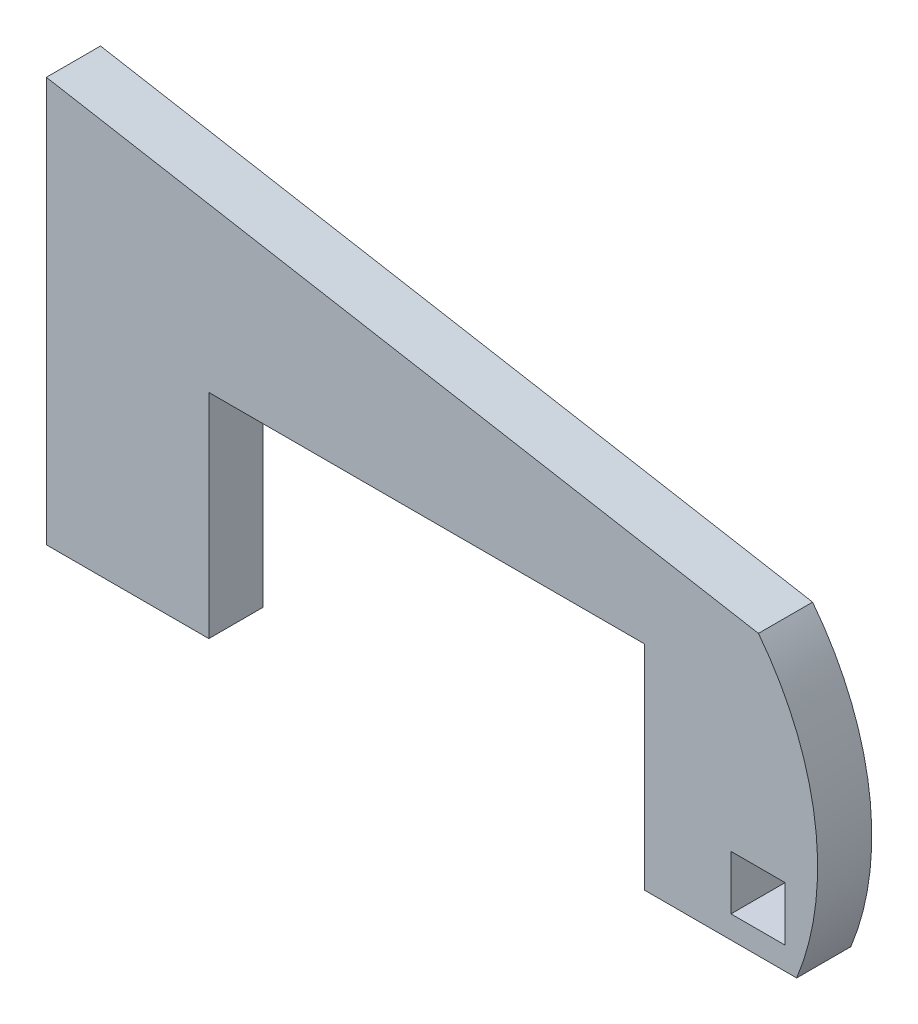
ISO-10303-21;
HEADER;
FILE_DESCRIPTION(('STEP AP214'),'2;1');
FILE_NAME('part.step','',(''),(''),'','','');
FILE_SCHEMA(('AUTOMOTIVE_DESIGN { 1 0 10303 214 1 1 1 1 }'));
ENDSEC;
DATA;
#1=APPLICATION_CONTEXT('core data for automotive mechanical design processes');
#2=APPLICATION_PROTOCOL_DEFINITION('international standard','automotive_design',2000,#1);
#3=PRODUCT_CONTEXT('',#1,'mechanical');
#4=PRODUCT('Part','Part','',(#3));
#5=PRODUCT_RELATED_PRODUCT_CATEGORY('part','',(#4));
#6=PRODUCT_DEFINITION_FORMATION('','',#4);
#7=PRODUCT_DEFINITION_CONTEXT('part definition',#1,'design');
#8=PRODUCT_DEFINITION('design','',#6,#7);
#9=PRODUCT_DEFINITION_SHAPE('','',#8);
#10=(LENGTH_UNIT() NAMED_UNIT(*) SI_UNIT(.MILLI.,.METRE.));
#11=(NAMED_UNIT(*) PLANE_ANGLE_UNIT() SI_UNIT($,.RADIAN.));
#12=(NAMED_UNIT(*) SI_UNIT($,.STERADIAN.) SOLID_ANGLE_UNIT());
#13=UNCERTAINTY_MEASURE_WITH_UNIT(LENGTH_MEASURE(1.E-05),#10,'distance_accuracy_value','');
#14=(GEOMETRIC_REPRESENTATION_CONTEXT(3) GLOBAL_UNCERTAINTY_ASSIGNED_CONTEXT((#13)) GLOBAL_UNIT_ASSIGNED_CONTEXT((#10,
#11,#12)) REPRESENTATION_CONTEXT('',''));
#15=CARTESIAN_POINT('',(0.,0.,0.));
#16=DIRECTION('',(0.,0.,1.));
#17=DIRECTION('',(1.,0.,0.));
#18=AXIS2_PLACEMENT_3D('',#15,#16,#17);
#19=CARTESIAN_POINT('',(20.,4.43336509645768,5.));
#20=DIRECTION('',(-0.173648177666926,-0.984807753012209,0.));
#21=DIRECTION('',(0.984807753012209,-0.173648177666926,0.));
#22=AXIS2_PLACEMENT_3D('',#19,#20,#21);
#23=PLANE('',#22);
#24=DIRECTION('',(-0.984807753012209,0.173648177666926,0.));
#25=VECTOR('',#24,1.);
#26=CARTESIAN_POINT('',(20.,4.43336509645768,5.));
#27=LINE('',#26,#25);
#28=CARTESIAN_POINT('',(10.5371757571876,6.10191632416762,5.));
#29=VERTEX_POINT('',#28);
#30=CARTESIAN_POINT('',(-55.2,17.6931540457339,5.));
#31=VERTEX_POINT('',#30);
#32=EDGE_CURVE('E167',#29,#31,#27,.T.);
#33=ORIENTED_EDGE('',*,*,#32,.F.);
#34=DIRECTION('',(0.,0.,-1.));
#35=VECTOR('',#34,1.);
#36=CARTESIAN_POINT('',(10.5371757571876,6.10191632416762,5.));
#37=LINE('',#36,#35);
#38=CARTESIAN_POINT('',(10.5371757571876,6.10191632416762,0.));
#39=VERTEX_POINT('',#38);
#40=EDGE_CURVE('E160',#29,#39,#37,.T.);
#41=ORIENTED_EDGE('',*,*,#40,.T.);
#42=DIRECTION('',(-0.984807753012209,0.173648177666926,0.));
#43=VECTOR('',#42,1.);
#44=CARTESIAN_POINT('',(20.,4.43336509645768,0.));
#45=LINE('',#44,#43);
#46=CARTESIAN_POINT('',(-55.2,17.6931540457339,0.));
#47=VERTEX_POINT('',#46);
#48=EDGE_CURVE('E164',#39,#47,#45,.T.);
#49=ORIENTED_EDGE('',*,*,#48,.T.);
#50=DIRECTION('',(0.,0.,-1.));
#51=VECTOR('',#50,1.);
#52=CARTESIAN_POINT('',(-55.2,17.6931540457339,5.));
#53=LINE('',#52,#51);
#54=EDGE_CURVE('E11',#31,#47,#53,.T.);
#55=ORIENTED_EDGE('',*,*,#54,.F.);
#56=EDGE_LOOP('',(#33,#41,#49,#55));
#57=FACE_BOUND('',#56,.T.);
#58=ADVANCED_FACE('F32',(#57),#23,.F.);
#59=CARTESIAN_POINT('',(-55.2,17.6931540457339,5.));
#60=DIRECTION('',(1.,0.,0.));
#61=DIRECTION('',(0.,0.,-1.));
#62=AXIS2_PLACEMENT_3D('',#59,#60,#61);
#63=PLANE('',#62);
#64=DIRECTION('',(0.,-1.,0.));
#65=VECTOR('',#64,1.);
#66=CARTESIAN_POINT('',(-55.2,17.6931540457339,0.));
#67=LINE('',#66,#65);
#68=CARTESIAN_POINT('',(-55.2,-19.685,0.));
#69=VERTEX_POINT('',#68);
#70=EDGE_CURVE('E185',#47,#69,#67,.T.);
#71=ORIENTED_EDGE('',*,*,#70,.T.);
#72=DIRECTION('',(0.,0.,-1.));
#73=VECTOR('',#72,1.);
#74=CARTESIAN_POINT('',(-55.2,-19.685,5.));
#75=LINE('',#74,#73);
#76=CARTESIAN_POINT('',(-55.2,-19.685,5.));
#77=VERTEX_POINT('',#76);
#78=EDGE_CURVE('E39',#77,#69,#75,.T.);
#79=ORIENTED_EDGE('',*,*,#78,.F.);
#80=DIRECTION('',(0.,-1.,0.));
#81=VECTOR('',#80,1.);
#82=CARTESIAN_POINT('',(-55.2,17.6931540457339,5.));
#83=LINE('',#82,#81);
#84=EDGE_CURVE('E169',#31,#77,#83,.T.);
#85=ORIENTED_EDGE('',*,*,#84,.F.);
#86=ORIENTED_EDGE('',*,*,#54,.T.);
#87=EDGE_LOOP('',(#71,#79,#85,#86));
#88=FACE_BOUND('',#87,.T.);
#89=ADVANCED_FACE('F236',(#88),#63,.F.);
#90=CARTESIAN_POINT('',(-55.2,-19.685,5.));
#91=DIRECTION('',(0.,1.,0.));
#92=DIRECTION('',(-1.,0.,0.));
#93=AXIS2_PLACEMENT_3D('',#90,#91,#92);
#94=PLANE('',#93);
#95=DIRECTION('',(1.,0.,0.));
#96=VECTOR('',#95,1.);
#97=CARTESIAN_POINT('',(-55.2,-19.685,0.));
#98=LINE('',#97,#96);
#99=CARTESIAN_POINT('',(-40.2,-19.685,0.));
#100=VERTEX_POINT('',#99);
#101=EDGE_CURVE('E187',#69,#100,#98,.T.);
#102=ORIENTED_EDGE('',*,*,#101,.T.);
#103=DIRECTION('',(0.,0.,-1.));
#104=VECTOR('',#103,1.);
#105=CARTESIAN_POINT('',(-40.2,-19.685,5.));
#106=LINE('',#105,#104);
#107=CARTESIAN_POINT('',(-40.2,-19.685,5.));
#108=VERTEX_POINT('',#107);
#109=EDGE_CURVE('E205',#108,#100,#106,.T.);
#110=ORIENTED_EDGE('',*,*,#109,.F.);
#111=DIRECTION('',(1.,0.,0.));
#112=VECTOR('',#111,1.);
#113=CARTESIAN_POINT('',(-55.2,-19.685,5.));
#114=LINE('',#113,#112);
#115=EDGE_CURVE('E172',#77,#108,#114,.T.);
#116=ORIENTED_EDGE('',*,*,#115,.F.);
#117=ORIENTED_EDGE('',*,*,#78,.T.);
#118=EDGE_LOOP('',(#102,#110,#116,#117));
#119=FACE_BOUND('',#118,.T.);
#120=ADVANCED_FACE('F212',(#119),#94,.F.);
#121=CARTESIAN_POINT('',(-40.2,-19.685,5.));
#122=DIRECTION('',(-1.,0.,0.));
#123=DIRECTION('',(0.,0.,1.));
#124=AXIS2_PLACEMENT_3D('',#121,#122,#123);
#125=PLANE('',#124);
#126=DIRECTION('',(0.,1.,0.));
#127=VECTOR('',#126,1.);
#128=CARTESIAN_POINT('',(-40.2,-19.685,0.));
#129=LINE('',#128,#127);
#130=CARTESIAN_POINT('',(-40.2,0.,0.));
#131=VERTEX_POINT('',#130);
#132=EDGE_CURVE('E189',#100,#131,#129,.T.);
#133=ORIENTED_EDGE('',*,*,#132,.T.);
#134=DIRECTION('',(0.,0.,-1.));
#135=VECTOR('',#134,1.);
#136=CARTESIAN_POINT('',(-40.2,0.,5.));
#137=LINE('',#136,#135);
#138=CARTESIAN_POINT('',(-40.2,0.,5.));
#139=VERTEX_POINT('',#138);
#140=EDGE_CURVE('E202',#139,#131,#137,.T.);
#141=ORIENTED_EDGE('',*,*,#140,.F.);
#142=DIRECTION('',(0.,1.,0.));
#143=VECTOR('',#142,1.);
#144=CARTESIAN_POINT('',(-40.2,-19.685,5.));
#145=LINE('',#144,#143);
#146=EDGE_CURVE('E174',#108,#139,#145,.T.);
#147=ORIENTED_EDGE('',*,*,#146,.F.);
#148=ORIENTED_EDGE('',*,*,#109,.T.);
#149=EDGE_LOOP('',(#133,#141,#147,#148));
#150=FACE_BOUND('',#149,.T.);
#151=ADVANCED_FACE('F226',(#150),#125,.F.);
#152=CARTESIAN_POINT('',(-40.2,0.,5.));
#153=DIRECTION('',(0.,1.,0.));
#154=DIRECTION('',(-1.,0.,0.));
#155=AXIS2_PLACEMENT_3D('',#152,#153,#154);
#156=PLANE('',#155);
#157=DIRECTION('',(1.,0.,0.));
#158=VECTOR('',#157,1.);
#159=CARTESIAN_POINT('',(-40.2,0.,0.));
#160=LINE('',#159,#158);
#161=CARTESIAN_POINT('',(0.,0.,0.));
#162=VERTEX_POINT('',#161);
#163=EDGE_CURVE('E191',#131,#162,#160,.T.);
#164=ORIENTED_EDGE('',*,*,#163,.T.);
#165=DIRECTION('',(0.,0.,-1.));
#166=VECTOR('',#165,1.);
#167=CARTESIAN_POINT('',(0.,0.,5.));
#168=LINE('',#167,#166);
#169=CARTESIAN_POINT('',(0.,0.,5.));
#170=VERTEX_POINT('',#169);
#171=EDGE_CURVE('E199',#170,#162,#168,.T.);
#172=ORIENTED_EDGE('',*,*,#171,.F.);
#173=DIRECTION('',(1.,0.,0.));
#174=VECTOR('',#173,1.);
#175=CARTESIAN_POINT('',(-40.2,0.,5.));
#176=LINE('',#175,#174);
#177=EDGE_CURVE('E176',#139,#170,#176,.T.);
#178=ORIENTED_EDGE('',*,*,#177,.F.);
#179=ORIENTED_EDGE('',*,*,#140,.T.);
#180=EDGE_LOOP('',(#164,#172,#178,#179));
#181=FACE_BOUND('',#180,.T.);
#182=ADVANCED_FACE('F230',(#181),#156,.F.);
#183=CARTESIAN_POINT('',(0.,0.,5.));
#184=DIRECTION('',(1.,0.,0.));
#185=DIRECTION('',(0.,1.,0.));
#186=AXIS2_PLACEMENT_3D('',#183,#184,#185);
#187=PLANE('',#186);
#188=DIRECTION('',(0.,-1.,0.));
#189=VECTOR('',#188,1.);
#190=CARTESIAN_POINT('',(0.,0.,0.));
#191=LINE('',#190,#189);
#192=CARTESIAN_POINT('',(0.,-19.685,0.));
#193=VERTEX_POINT('',#192);
#194=EDGE_CURVE('E193',#162,#193,#191,.T.);
#195=ORIENTED_EDGE('',*,*,#194,.T.);
#196=DIRECTION('',(0.,0.,-1.));
#197=VECTOR('',#196,1.);
#198=CARTESIAN_POINT('',(0.,-19.685,5.));
#199=LINE('',#198,#197);
#200=CARTESIAN_POINT('',(0.,-19.685,5.));
#201=VERTEX_POINT('',#200);
#202=EDGE_CURVE('E183',#201,#193,#199,.T.);
#203=ORIENTED_EDGE('',*,*,#202,.F.);
#204=DIRECTION('',(0.,-1.,0.));
#205=VECTOR('',#204,1.);
#206=CARTESIAN_POINT('',(0.,0.,5.));
#207=LINE('',#206,#205);
#208=EDGE_CURVE('E178',#170,#201,#207,.T.);
#209=ORIENTED_EDGE('',*,*,#208,.F.);
#210=ORIENTED_EDGE('',*,*,#171,.T.);
#211=EDGE_LOOP('',(#195,#203,#209,#210));
#212=FACE_BOUND('',#211,.T.);
#213=ADVANCED_FACE('F245',(#212),#187,.F.);
#214=CARTESIAN_POINT('',(0.,-19.685,5.));
#215=DIRECTION('',(0.,1.,0.));
#216=DIRECTION('',(0.,0.,1.));
#217=AXIS2_PLACEMENT_3D('',#214,#215,#216);
#218=PLANE('',#217);
#219=DIRECTION('',(1.,0.,0.));
#220=VECTOR('',#219,1.);
#221=CARTESIAN_POINT('',(0.,-19.685,0.));
#222=LINE('',#221,#220);
#223=CARTESIAN_POINT('',(14.0650201277706,-19.685,0.));
#224=VERTEX_POINT('',#223);
#225=EDGE_CURVE('E170',#193,#224,#222,.T.);
#226=ORIENTED_EDGE('',*,*,#225,.T.);
#227=DIRECTION('',(0.,0.,-1.));
#228=VECTOR('',#227,1.);
#229=CARTESIAN_POINT('',(14.0650201277706,-19.685,5.));
#230=LINE('',#229,#228);
#231=CARTESIAN_POINT('',(14.0650201277706,-19.685,5.));
#232=VERTEX_POINT('',#231);
#233=EDGE_CURVE('E162',#232,#224,#230,.T.);
#234=ORIENTED_EDGE('',*,*,#233,.F.);
#235=DIRECTION('',(1.,0.,0.));
#236=VECTOR('',#235,1.);
#237=CARTESIAN_POINT('',(0.,-19.685,5.));
#238=LINE('',#237,#236);
#239=EDGE_CURVE('E180',#201,#232,#238,.T.);
#240=ORIENTED_EDGE('',*,*,#239,.F.);
#241=ORIENTED_EDGE('',*,*,#202,.T.);
#242=EDGE_LOOP('',(#226,#234,#240,#241));
#243=FACE_BOUND('',#242,.T.);
#244=ADVANCED_FACE('F242',(#243),#218,.F.);
#245=CARTESIAN_POINT('',(0.,0.,5.));
#246=DIRECTION('',(0.,0.,-1.));
#247=DIRECTION('',(-1.,0.,0.));
#248=AXIS2_PLACEMENT_3D('',#245,#246,#247);
#249=PLANE('',#248);
#250=DIRECTION('',(-1.,0.,0.));
#251=VECTOR('',#250,1.);
#252=CARTESIAN_POINT('',(13.,-17.5924999999999,5.));
#253=LINE('',#252,#251);
#254=CARTESIAN_POINT('',(13.,-17.5924999999999,5.));
#255=VERTEX_POINT('',#254);
#256=CARTESIAN_POINT('',(8.,-17.5924999999999,5.));
#257=VERTEX_POINT('',#256);
#258=EDGE_CURVE('E128',#255,#257,#253,.T.);
#259=ORIENTED_EDGE('',*,*,#258,.T.);
#260=DIRECTION('',(0.,1.,0.));
#261=VECTOR('',#260,1.);
#262=CARTESIAN_POINT('',(8.,-12.5924999999999,5.));
#263=LINE('',#262,#261);
#264=CARTESIAN_POINT('',(8.,-12.5924999999999,5.));
#265=VERTEX_POINT('',#264);
#266=EDGE_CURVE('E122',#257,#265,#263,.T.);
#267=ORIENTED_EDGE('',*,*,#266,.T.);
#268=DIRECTION('',(1.,0.,0.));
#269=VECTOR('',#268,1.);
#270=CARTESIAN_POINT('',(13.,-12.5924999999999,5.));
#271=LINE('',#270,#269);
#272=CARTESIAN_POINT('',(13.,-12.5924999999999,5.));
#273=VERTEX_POINT('',#272);
#274=EDGE_CURVE('E131',#265,#273,#271,.T.);
#275=ORIENTED_EDGE('',*,*,#274,.T.);
#276=DIRECTION('',(0.,-1.,0.));
#277=VECTOR('',#276,1.);
#278=CARTESIAN_POINT('',(13.,-17.5924999999999,5.));
#279=LINE('',#278,#277);
#280=EDGE_CURVE('E46',#273,#255,#279,.T.);
#281=ORIENTED_EDGE('',*,*,#280,.T.);
#282=EDGE_LOOP('',(#259,#267,#275,#281));
#283=FACE_BOUND('',#282,.T.);
#284=ORIENTED_EDGE('',*,*,#239,.T.);
#285=CARTESIAN_POINT('',(-10.,-9.84250000000009,5.));
#286=DIRECTION('',(0.,0.,1.));
#287=DIRECTION('',(1.,0.,0.));
#288=AXIS2_PLACEMENT_3D('',#285,#286,#287);
#289=CIRCLE('',#288,26.);
#290=EDGE_CURVE('E157',#232,#29,#289,.T.);
#291=ORIENTED_EDGE('',*,*,#290,.T.);
#292=ORIENTED_EDGE('',*,*,#32,.T.);
#293=ORIENTED_EDGE('',*,*,#84,.T.);
#294=ORIENTED_EDGE('',*,*,#115,.T.);
#295=ORIENTED_EDGE('',*,*,#146,.T.);
#296=ORIENTED_EDGE('',*,*,#177,.T.);
#297=ORIENTED_EDGE('',*,*,#208,.T.);
#298=EDGE_LOOP('',(#284,#291,#292,#293,#294,#295,#296,#297));
#299=FACE_BOUND('',#298,.T.);
#300=ADVANCED_FACE('F135',(#283,#299),#249,.F.);
#301=CARTESIAN_POINT('',(0.,0.,0.));
#302=DIRECTION('',(0.,0.,-1.));
#303=DIRECTION('',(-1.,0.,0.));
#304=AXIS2_PLACEMENT_3D('',#301,#302,#303);
#305=PLANE('',#304);
#306=DIRECTION('',(0.,1.,0.));
#307=VECTOR('',#306,1.);
#308=CARTESIAN_POINT('',(8.,-12.5924999999999,0.));
#309=LINE('',#308,#307);
#310=CARTESIAN_POINT('',(8.,-17.5924999999999,0.));
#311=VERTEX_POINT('',#310);
#312=CARTESIAN_POINT('',(8.,-12.5924999999999,0.));
#313=VERTEX_POINT('',#312);
#314=EDGE_CURVE('E54',#311,#313,#309,.T.);
#315=ORIENTED_EDGE('',*,*,#314,.F.);
#316=DIRECTION('',(-1.,0.,0.));
#317=VECTOR('',#316,1.);
#318=CARTESIAN_POINT('',(13.,-17.5924999999999,0.));
#319=LINE('',#318,#317);
#320=CARTESIAN_POINT('',(13.,-17.5924999999999,0.));
#321=VERTEX_POINT('',#320);
#322=EDGE_CURVE('E138',#321,#311,#319,.T.);
#323=ORIENTED_EDGE('',*,*,#322,.F.);
#324=DIRECTION('',(0.,-1.,0.));
#325=VECTOR('',#324,1.);
#326=CARTESIAN_POINT('',(13.,-17.5924999999999,0.));
#327=LINE('',#326,#325);
#328=CARTESIAN_POINT('',(13.,-12.5924999999999,0.));
#329=VERTEX_POINT('',#328);
#330=EDGE_CURVE('E141',#329,#321,#327,.T.);
#331=ORIENTED_EDGE('',*,*,#330,.F.);
#332=DIRECTION('',(1.,0.,0.));
#333=VECTOR('',#332,1.);
#334=CARTESIAN_POINT('',(13.,-12.5924999999999,0.));
#335=LINE('',#334,#333);
#336=EDGE_CURVE('E147',#313,#329,#335,.T.);
#337=ORIENTED_EDGE('',*,*,#336,.F.);
#338=EDGE_LOOP('',(#315,#323,#331,#337));
#339=FACE_BOUND('',#338,.T.);
#340=CARTESIAN_POINT('',(-10.,-9.84250000000009,0.));
#341=DIRECTION('',(0.,0.,1.));
#342=DIRECTION('',(1.,0.,0.));
#343=AXIS2_PLACEMENT_3D('',#340,#341,#342);
#344=CIRCLE('',#343,26.);
#345=EDGE_CURVE('E153',#224,#39,#344,.T.);
#346=ORIENTED_EDGE('',*,*,#345,.F.);
#347=ORIENTED_EDGE('',*,*,#225,.F.);
#348=ORIENTED_EDGE('',*,*,#194,.F.);
#349=ORIENTED_EDGE('',*,*,#163,.F.);
#350=ORIENTED_EDGE('',*,*,#132,.F.);
#351=ORIENTED_EDGE('',*,*,#101,.F.);
#352=ORIENTED_EDGE('',*,*,#70,.F.);
#353=ORIENTED_EDGE('',*,*,#48,.F.);
#354=EDGE_LOOP('',(#346,#347,#348,#349,#350,#351,#352,#353));
#355=FACE_BOUND('',#354,.T.);
#356=ADVANCED_FACE('F220',(#339,#355),#305,.T.);
#357=CARTESIAN_POINT('',(-10.,-9.84250000000009,5.));
#358=DIRECTION('',(0.,0.,-1.));
#359=DIRECTION('',(-1.,0.,0.));
#360=AXIS2_PLACEMENT_3D('',#357,#358,#359);
#361=CYLINDRICAL_SURFACE('',#360,26.);
#362=ORIENTED_EDGE('',*,*,#345,.T.);
#363=ORIENTED_EDGE('',*,*,#40,.F.);
#364=ORIENTED_EDGE('',*,*,#290,.F.);
#365=ORIENTED_EDGE('',*,*,#233,.T.);
#366=EDGE_LOOP('',(#362,#363,#364,#365));
#367=FACE_BOUND('',#366,.T.);
#368=ADVANCED_FACE('F304',(#367),#361,.T.);
#369=CARTESIAN_POINT('',(8.,-12.5924999999999,5.));
#370=DIRECTION('',(-1.,0.,0.));
#371=DIRECTION('',(0.,0.,1.));
#372=AXIS2_PLACEMENT_3D('',#369,#370,#371);
#373=PLANE('',#372);
#374=ORIENTED_EDGE('',*,*,#314,.T.);
#375=DIRECTION('',(0.,0.,-1.));
#376=VECTOR('',#375,1.);
#377=CARTESIAN_POINT('',(8.,-12.5924999999999,5.));
#378=LINE('',#377,#376);
#379=EDGE_CURVE('E118',#265,#313,#378,.T.);
#380=ORIENTED_EDGE('',*,*,#379,.F.);
#381=ORIENTED_EDGE('',*,*,#266,.F.);
#382=DIRECTION('',(0.,0.,-1.));
#383=VECTOR('',#382,1.);
#384=CARTESIAN_POINT('',(8.,-17.5924999999999,5.));
#385=LINE('',#384,#383);
#386=EDGE_CURVE('E151',#257,#311,#385,.T.);
#387=ORIENTED_EDGE('',*,*,#386,.T.);
#388=EDGE_LOOP('',(#374,#380,#381,#387));
#389=FACE_BOUND('',#388,.T.);
#390=ADVANCED_FACE('F120',(#389),#373,.F.);
#391=CARTESIAN_POINT('',(13.,-17.5924999999999,5.));
#392=DIRECTION('',(0.,-1.,0.));
#393=DIRECTION('',(0.,0.,-1.));
#394=AXIS2_PLACEMENT_3D('',#391,#392,#393);
#395=PLANE('',#394);
#396=ORIENTED_EDGE('',*,*,#322,.T.);
#397=ORIENTED_EDGE('',*,*,#386,.F.);
#398=ORIENTED_EDGE('',*,*,#258,.F.);
#399=DIRECTION('',(0.,0.,-1.));
#400=VECTOR('',#399,1.);
#401=CARTESIAN_POINT('',(13.,-17.5924999999999,5.));
#402=LINE('',#401,#400);
#403=EDGE_CURVE('E154',#255,#321,#402,.T.);
#404=ORIENTED_EDGE('',*,*,#403,.T.);
#405=EDGE_LOOP('',(#396,#397,#398,#404));
#406=FACE_BOUND('',#405,.T.);
#407=ADVANCED_FACE('F322',(#406),#395,.F.);
#408=CARTESIAN_POINT('',(13.,-17.5924999999999,5.));
#409=DIRECTION('',(1.,0.,0.));
#410=DIRECTION('',(0.,0.,-1.));
#411=AXIS2_PLACEMENT_3D('',#408,#409,#410);
#412=PLANE('',#411);
#413=ORIENTED_EDGE('',*,*,#330,.T.);
#414=ORIENTED_EDGE('',*,*,#403,.F.);
#415=ORIENTED_EDGE('',*,*,#280,.F.);
#416=DIRECTION('',(0.,0.,-1.));
#417=VECTOR('',#416,1.);
#418=CARTESIAN_POINT('',(13.,-12.5924999999999,5.));
#419=LINE('',#418,#417);
#420=EDGE_CURVE('E127',#273,#329,#419,.T.);
#421=ORIENTED_EDGE('',*,*,#420,.T.);
#422=EDGE_LOOP('',(#413,#414,#415,#421));
#423=FACE_BOUND('',#422,.T.);
#424=ADVANCED_FACE('F331',(#423),#412,.F.);
#425=CARTESIAN_POINT('',(13.,-12.5924999999999,5.));
#426=DIRECTION('',(0.,1.,0.));
#427=DIRECTION('',(0.,0.,1.));
#428=AXIS2_PLACEMENT_3D('',#425,#426,#427);
#429=PLANE('',#428);
#430=ORIENTED_EDGE('',*,*,#336,.T.);
#431=ORIENTED_EDGE('',*,*,#420,.F.);
#432=ORIENTED_EDGE('',*,*,#274,.F.);
#433=ORIENTED_EDGE('',*,*,#379,.T.);
#434=EDGE_LOOP('',(#430,#431,#432,#433));
#435=FACE_BOUND('',#434,.T.);
#436=ADVANCED_FACE('F132',(#435),#429,.F.);
#437=CLOSED_SHELL('',(#58,#89,#120,#151,#182,#213,#244,#300,#356,#368,#390,#407,#424,#436));
#438=MANIFOLD_SOLID_BREP('B2',#437);
#439=ADVANCED_BREP_SHAPE_REPRESENTATION('',(#18,#438),#14);
#440=SHAPE_DEFINITION_REPRESENTATION(#9,#439);
ENDSEC;
END-ISO-10303-21;
